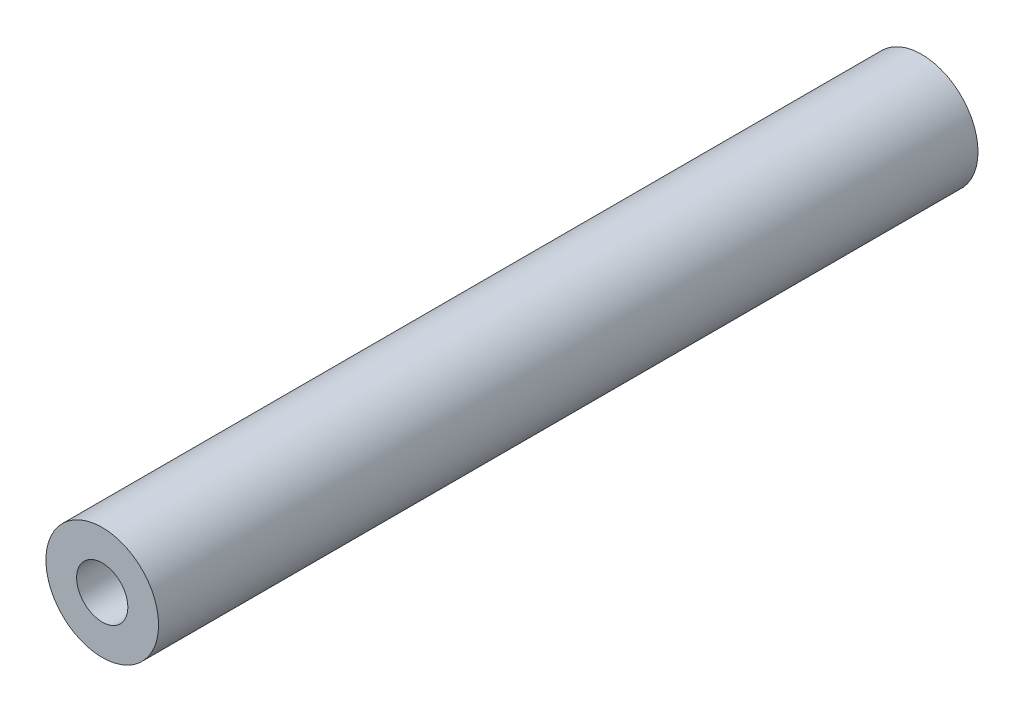
ISO-10303-21;
HEADER;
FILE_DESCRIPTION(('STEP AP214'),'2;1');
FILE_NAME('part.step','',(''),(''),'','','');
FILE_SCHEMA(('AUTOMOTIVE_DESIGN { 1 0 10303 214 1 1 1 1 }'));
ENDSEC;
DATA;
#1=APPLICATION_CONTEXT('core data for automotive mechanical design processes');
#2=APPLICATION_PROTOCOL_DEFINITION('international standard','automotive_design',2000,#1);
#3=PRODUCT_CONTEXT('',#1,'mechanical');
#4=PRODUCT('Part','Part','',(#3));
#5=PRODUCT_RELATED_PRODUCT_CATEGORY('part','',(#4));
#6=PRODUCT_DEFINITION_FORMATION('','',#4);
#7=PRODUCT_DEFINITION_CONTEXT('part definition',#1,'design');
#8=PRODUCT_DEFINITION('design','',#6,#7);
#9=PRODUCT_DEFINITION_SHAPE('','',#8);
#10=(LENGTH_UNIT() NAMED_UNIT(*) SI_UNIT(.MILLI.,.METRE.));
#11=(NAMED_UNIT(*) PLANE_ANGLE_UNIT() SI_UNIT($,.RADIAN.));
#12=(NAMED_UNIT(*) SI_UNIT($,.STERADIAN.) SOLID_ANGLE_UNIT());
#13=UNCERTAINTY_MEASURE_WITH_UNIT(LENGTH_MEASURE(1.E-05),#10,'distance_accuracy_value','');
#14=(GEOMETRIC_REPRESENTATION_CONTEXT(3) GLOBAL_UNCERTAINTY_ASSIGNED_CONTEXT((#13)) GLOBAL_UNIT_ASSIGNED_CONTEXT((#10,
#11,#12)) REPRESENTATION_CONTEXT('',''));
#15=CARTESIAN_POINT('',(0.,0.,0.));
#16=DIRECTION('',(0.,0.,1.));
#17=DIRECTION('',(1.,0.,0.));
#18=AXIS2_PLACEMENT_3D('',#15,#16,#17);
#19=CARTESIAN_POINT('',(0.,0.,-20.));
#20=DIRECTION('',(0.,0.,1.));
#21=DIRECTION('',(1.,0.,0.));
#22=AXIS2_PLACEMENT_3D('',#19,#20,#21);
#23=CYLINDRICAL_SURFACE('',#22,2.75);
#24=CARTESIAN_POINT('',(0.,0.,-20.));
#25=DIRECTION('',(0.,0.,1.));
#26=DIRECTION('',(1.,0.,0.));
#27=AXIS2_PLACEMENT_3D('',#24,#25,#26);
#28=CIRCLE('',#27,2.75);
#29=CARTESIAN_POINT('',(2.75,0.,-20.));
#30=VERTEX_POINT('',#29);
#31=EDGE_CURVE('E10',#30,#30,#28,.T.);
#32=ORIENTED_EDGE('',*,*,#31,.T.);
#33=EDGE_LOOP('',(#32));
#34=FACE_BOUND('',#33,.T.);
#35=CARTESIAN_POINT('',(0.,0.,20.));
#36=DIRECTION('',(0.,0.,1.));
#37=DIRECTION('',(1.,0.,0.));
#38=AXIS2_PLACEMENT_3D('',#35,#36,#37);
#39=CIRCLE('',#38,2.75);
#40=CARTESIAN_POINT('',(2.75,0.,20.));
#41=VERTEX_POINT('',#40);
#42=EDGE_CURVE('E40',#41,#41,#39,.T.);
#43=ORIENTED_EDGE('',*,*,#42,.F.);
#44=EDGE_LOOP('',(#43));
#45=FACE_BOUND('',#44,.T.);
#46=ADVANCED_FACE('F34',(#34,#45),#23,.T.);
#47=CARTESIAN_POINT('',(0.,0.,-20.));
#48=DIRECTION('',(0.,0.,1.));
#49=DIRECTION('',(1.,0.,0.));
#50=AXIS2_PLACEMENT_3D('',#47,#48,#49);
#51=PLANE('',#50);
#52=CARTESIAN_POINT('',(0.,0.,-20.));
#53=DIRECTION('',(0.,0.,-1.));
#54=DIRECTION('',(-1.,0.,0.));
#55=AXIS2_PLACEMENT_3D('',#52,#53,#54);
#56=CIRCLE('',#55,1.25);
#57=CARTESIAN_POINT('',(-1.25,0.,-20.));
#58=VERTEX_POINT('',#57);
#59=EDGE_CURVE('E54',#58,#58,#56,.T.);
#60=ORIENTED_EDGE('',*,*,#59,.F.);
#61=EDGE_LOOP('',(#60));
#62=FACE_BOUND('',#61,.T.);
#63=ORIENTED_EDGE('',*,*,#31,.F.);
#64=EDGE_LOOP('',(#63));
#65=FACE_BOUND('',#64,.T.);
#66=ADVANCED_FACE('F69',(#62,#65),#51,.F.);
#67=CARTESIAN_POINT('',(0.,0.,20.));
#68=DIRECTION('',(0.,0.,1.));
#69=DIRECTION('',(1.,0.,0.));
#70=AXIS2_PLACEMENT_3D('',#67,#68,#69);
#71=PLANE('',#70);
#72=CARTESIAN_POINT('',(0.,0.,20.));
#73=DIRECTION('',(0.,0.,1.));
#74=DIRECTION('',(1.,0.,0.));
#75=AXIS2_PLACEMENT_3D('',#72,#73,#74);
#76=CIRCLE('',#75,1.25);
#77=CARTESIAN_POINT('',(1.25,0.,20.));
#78=VERTEX_POINT('',#77);
#79=EDGE_CURVE('E48',#78,#78,#76,.T.);
#80=ORIENTED_EDGE('',*,*,#79,.F.);
#81=EDGE_LOOP('',(#80));
#82=FACE_BOUND('',#81,.T.);
#83=ORIENTED_EDGE('',*,*,#42,.T.);
#84=EDGE_LOOP('',(#83));
#85=FACE_BOUND('',#84,.T.);
#86=ADVANCED_FACE('F72',(#82,#85),#71,.T.);
#87=CARTESIAN_POINT('',(0.,0.,5.));
#88=DIRECTION('',(0.,0.,1.));
#89=DIRECTION('',(1.,0.,0.));
#90=AXIS2_PLACEMENT_3D('',#87,#88,#89);
#91=CYLINDRICAL_SURFACE('',#90,1.25);
#92=CARTESIAN_POINT('',(0.,0.,5.));
#93=DIRECTION('',(0.,0.,1.));
#94=DIRECTION('',(1.,0.,0.));
#95=AXIS2_PLACEMENT_3D('',#92,#93,#94);
#96=CIRCLE('',#95,1.25);
#97=CARTESIAN_POINT('',(1.25,0.,5.));
#98=VERTEX_POINT('',#97);
#99=EDGE_CURVE('E44',#98,#98,#96,.T.);
#100=ORIENTED_EDGE('',*,*,#99,.F.);
#101=EDGE_LOOP('',(#100));
#102=FACE_BOUND('',#101,.T.);
#103=ORIENTED_EDGE('',*,*,#79,.T.);
#104=EDGE_LOOP('',(#103));
#105=FACE_BOUND('',#104,.T.);
#106=ADVANCED_FACE('F77',(#102,#105),#91,.F.);
#107=CARTESIAN_POINT('',(0.,0.,5.));
#108=DIRECTION('',(0.,0.,1.));
#109=DIRECTION('',(1.,0.,0.));
#110=AXIS2_PLACEMENT_3D('',#107,#108,#109);
#111=PLANE('',#110);
#112=ORIENTED_EDGE('',*,*,#99,.T.);
#113=EDGE_LOOP('',(#112));
#114=FACE_BOUND('',#113,.T.);
#115=ADVANCED_FACE('F65',(#114),#111,.T.);
#116=CARTESIAN_POINT('',(0.,0.,-5.));
#117=DIRECTION('',(0.,0.,-1.));
#118=DIRECTION('',(-1.,0.,0.));
#119=AXIS2_PLACEMENT_3D('',#116,#117,#118);
#120=CYLINDRICAL_SURFACE('',#119,1.25);
#121=CARTESIAN_POINT('',(0.,0.,-5.));
#122=DIRECTION('',(0.,0.,-1.));
#123=DIRECTION('',(-1.,0.,0.));
#124=AXIS2_PLACEMENT_3D('',#121,#122,#123);
#125=CIRCLE('',#124,1.25);
#126=CARTESIAN_POINT('',(-1.25,0.,-5.));
#127=VERTEX_POINT('',#126);
#128=EDGE_CURVE('E52',#127,#127,#125,.T.);
#129=ORIENTED_EDGE('',*,*,#128,.F.);
#130=EDGE_LOOP('',(#129));
#131=FACE_BOUND('',#130,.T.);
#132=ORIENTED_EDGE('',*,*,#59,.T.);
#133=EDGE_LOOP('',(#132));
#134=FACE_BOUND('',#133,.T.);
#135=ADVANCED_FACE('F62',(#131,#134),#120,.F.);
#136=CARTESIAN_POINT('',(0.,0.,-5.));
#137=DIRECTION('',(0.,0.,-1.));
#138=DIRECTION('',(-1.,0.,0.));
#139=AXIS2_PLACEMENT_3D('',#136,#137,#138);
#140=PLANE('',#139);
#141=ORIENTED_EDGE('',*,*,#128,.T.);
#142=EDGE_LOOP('',(#141));
#143=FACE_BOUND('',#142,.T.);
#144=ADVANCED_FACE('F60',(#143),#140,.T.);
#145=CLOSED_SHELL('',(#46,#66,#86,#106,#115,#135,#144));
#146=MANIFOLD_SOLID_BREP('B2',#145);
#147=ADVANCED_BREP_SHAPE_REPRESENTATION('',(#18,#146),#14);
#148=SHAPE_DEFINITION_REPRESENTATION(#9,#147);
ENDSEC;
END-ISO-10303-21;
